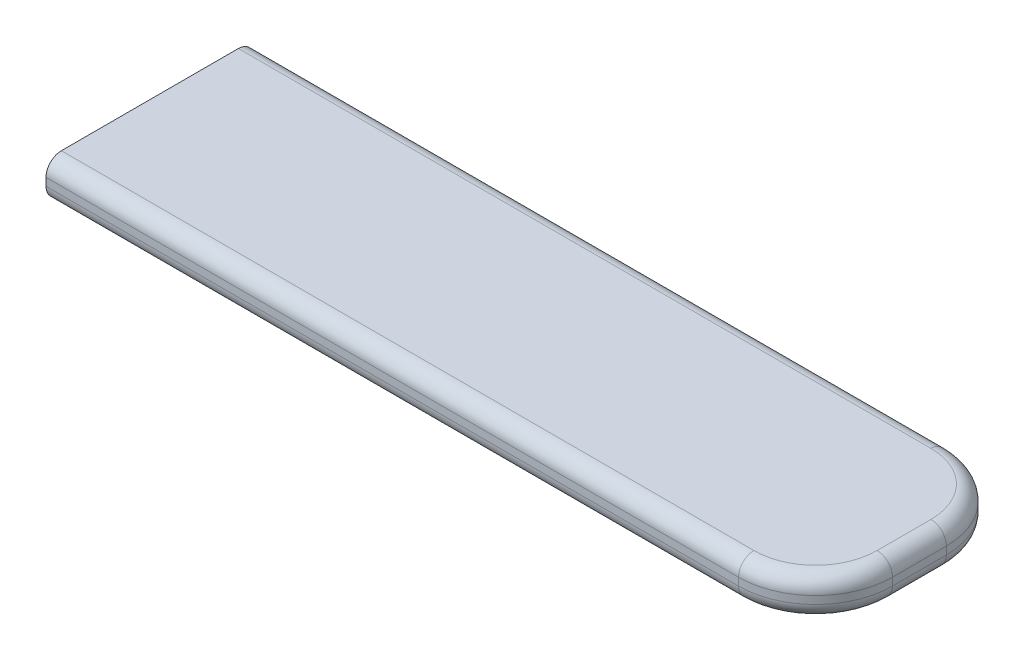
ISO-10303-21;
HEADER;
FILE_DESCRIPTION(('STEP AP214'),'2;1');
FILE_NAME('part.step','',(''),(''),'','','');
FILE_SCHEMA(('AUTOMOTIVE_DESIGN { 1 0 10303 214 1 1 1 1 }'));
ENDSEC;
DATA;
#1=APPLICATION_CONTEXT('core data for automotive mechanical design processes');
#2=APPLICATION_PROTOCOL_DEFINITION('international standard','automotive_design',2000,#1);
#3=PRODUCT_CONTEXT('',#1,'mechanical');
#4=PRODUCT('Part','Part','',(#3));
#5=PRODUCT_RELATED_PRODUCT_CATEGORY('part','',(#4));
#6=PRODUCT_DEFINITION_FORMATION('','',#4);
#7=PRODUCT_DEFINITION_CONTEXT('part definition',#1,'design');
#8=PRODUCT_DEFINITION('design','',#6,#7);
#9=PRODUCT_DEFINITION_SHAPE('','',#8);
#10=(LENGTH_UNIT() NAMED_UNIT(*) SI_UNIT(.MILLI.,.METRE.));
#11=(NAMED_UNIT(*) PLANE_ANGLE_UNIT() SI_UNIT($,.RADIAN.));
#12=(NAMED_UNIT(*) SI_UNIT($,.STERADIAN.) SOLID_ANGLE_UNIT());
#13=UNCERTAINTY_MEASURE_WITH_UNIT(LENGTH_MEASURE(1.E-05),#10,'distance_accuracy_value','');
#14=(GEOMETRIC_REPRESENTATION_CONTEXT(3) GLOBAL_UNCERTAINTY_ASSIGNED_CONTEXT((#13)) GLOBAL_UNIT_ASSIGNED_CONTEXT((#10,
#11,#12)) REPRESENTATION_CONTEXT('',''));
#15=CARTESIAN_POINT('',(0.,0.,0.));
#16=DIRECTION('',(0.,0.,1.));
#17=DIRECTION('',(1.,0.,0.));
#18=AXIS2_PLACEMENT_3D('',#15,#16,#17);
#19=CARTESIAN_POINT('',(0.,50.,0.));
#20=DIRECTION('',(-1.,0.,0.));
#21=DIRECTION('',(0.,0.,1.));
#22=AXIS2_PLACEMENT_3D('',#19,#20,#21);
#23=PLANE('',#22);
#24=DIRECTION('',(0.,-1.,0.));
#25=VECTOR('',#24,1.);
#26=CARTESIAN_POINT('',(0.,0.,-100.));
#27=LINE('',#26,#25);
#28=CARTESIAN_POINT('',(0.,30.,-100.));
#29=VERTEX_POINT('',#28);
#30=CARTESIAN_POINT('',(0.,20.,-100.));
#31=VERTEX_POINT('',#30);
#32=EDGE_CURVE('E156',#29,#31,#27,.T.);
#33=ORIENTED_EDGE('',*,*,#32,.T.);
#34=DIRECTION('',(0.,0.,-1.));
#35=VECTOR('',#34,1.);
#36=CARTESIAN_POINT('',(0.,20.,0.));
#37=LINE('',#36,#35);
#38=CARTESIAN_POINT('',(0.,20.,-170.));
#39=VERTEX_POINT('',#38);
#40=EDGE_CURVE('E272',#31,#39,#37,.T.);
#41=ORIENTED_EDGE('',*,*,#40,.T.);
#42=DIRECTION('',(0.,-1.,0.));
#43=VECTOR('',#42,1.);
#44=CARTESIAN_POINT('',(0.,50.,-170.));
#45=LINE('',#44,#43);
#46=CARTESIAN_POINT('',(0.,30.,-170.));
#47=VERTEX_POINT('',#46);
#48=EDGE_CURVE('E233',#39,#47,#45,.F.);
#49=ORIENTED_EDGE('',*,*,#48,.T.);
#50=DIRECTION('',(0.,0.,-1.));
#51=VECTOR('',#50,1.);
#52=CARTESIAN_POINT('',(0.,30.,-100.));
#53=LINE('',#52,#51);
#54=EDGE_CURVE('E269',#47,#29,#53,.F.);
#55=ORIENTED_EDGE('',*,*,#54,.T.);
#56=EDGE_LOOP('',(#33,#41,#49,#55));
#57=FACE_BOUND('',#56,.T.);
#58=ADVANCED_FACE('F41',(#57),#23,.F.);
#59=CARTESIAN_POINT('',(0.,50.,-270.));
#60=DIRECTION('',(0.,0.,1.));
#61=DIRECTION('',(1.,0.,0.));
#62=AXIS2_PLACEMENT_3D('',#59,#60,#61);
#63=PLANE('',#62);
#64=DIRECTION('',(0.,-1.,0.));
#65=VECTOR('',#64,1.);
#66=CARTESIAN_POINT('',(-100.,50.,-270.));
#67=LINE('',#66,#65);
#68=CARTESIAN_POINT('',(-100.,30.,-270.));
#69=VERTEX_POINT('',#68);
#70=CARTESIAN_POINT('',(-100.,20.,-270.));
#71=VERTEX_POINT('',#70);
#72=EDGE_CURVE('E137',#69,#71,#67,.T.);
#73=ORIENTED_EDGE('',*,*,#72,.T.);
#74=DIRECTION('',(-1.,0.,0.));
#75=VECTOR('',#74,1.);
#76=CARTESIAN_POINT('',(0.,20.,-270.));
#77=LINE('',#76,#75);
#78=CARTESIAN_POINT('',(-1000.,20.,-270.));
#79=VERTEX_POINT('',#78);
#80=EDGE_CURVE('E144',#71,#79,#77,.T.);
#81=ORIENTED_EDGE('',*,*,#80,.T.);
#82=DIRECTION('',(0.,-1.,0.));
#83=VECTOR('',#82,1.);
#84=CARTESIAN_POINT('',(-1000.,50.,-270.));
#85=LINE('',#84,#83);
#86=CARTESIAN_POINT('',(-1000.,30.,-270.));
#87=VERTEX_POINT('',#86);
#88=EDGE_CURVE('E140',#87,#79,#85,.T.);
#89=ORIENTED_EDGE('',*,*,#88,.F.);
#90=DIRECTION('',(-1.,0.,0.));
#91=VECTOR('',#90,1.);
#92=CARTESIAN_POINT('',(-100.,30.,-270.));
#93=LINE('',#92,#91);
#94=EDGE_CURVE('E133',#87,#69,#93,.F.);
#95=ORIENTED_EDGE('',*,*,#94,.T.);
#96=EDGE_LOOP('',(#73,#81,#89,#95));
#97=FACE_BOUND('',#96,.T.);
#98=ADVANCED_FACE('F135',(#97),#63,.F.);
#99=CARTESIAN_POINT('',(-1000.,50.,1.22464679914735E-13));
#100=DIRECTION('',(-1.,0.,0.));
#101=DIRECTION('',(0.,0.,1.));
#102=AXIS2_PLACEMENT_3D('',#99,#100,#101);
#103=PLANE('',#102);
#104=ORIENTED_EDGE('',*,*,#88,.T.);
#105=CARTESIAN_POINT('',(-1000.,20.,-250.));
#106=DIRECTION('',(-1.,0.,0.));
#107=DIRECTION('',(0.,0.,1.));
#108=AXIS2_PLACEMENT_3D('',#105,#106,#107);
#109=CIRCLE('',#108,20.);
#110=CARTESIAN_POINT('',(-1000.,0.,-250.));
#111=VERTEX_POINT('',#110);
#112=EDGE_CURVE('E250',#79,#111,#109,.T.);
#113=ORIENTED_EDGE('',*,*,#112,.T.);
#114=DIRECTION('',(0.,0.,-1.));
#115=VECTOR('',#114,1.);
#116=CARTESIAN_POINT('',(-1000.,0.,1.22464679914735E-13));
#117=LINE('',#116,#115);
#118=CARTESIAN_POINT('',(-1000.,0.,-19.9999999999999));
#119=VERTEX_POINT('',#118);
#120=EDGE_CURVE('E209',#119,#111,#117,.T.);
#121=ORIENTED_EDGE('',*,*,#120,.F.);
#122=CARTESIAN_POINT('',(-1000.,20.,-19.9999999999999));
#123=DIRECTION('',(-1.,0.,0.));
#124=DIRECTION('',(0.,0.,1.));
#125=AXIS2_PLACEMENT_3D('',#122,#123,#124);
#126=CIRCLE('',#125,20.);
#127=CARTESIAN_POINT('',(-1000.,20.,1.22464679914735E-13));
#128=VERTEX_POINT('',#127);
#129=EDGE_CURVE('E244',#119,#128,#126,.T.);
#130=ORIENTED_EDGE('',*,*,#129,.T.);
#131=DIRECTION('',(0.,-1.,0.));
#132=VECTOR('',#131,1.);
#133=CARTESIAN_POINT('',(-1000.,50.,1.22464679914735E-13));
#134=LINE('',#133,#132);
#135=CARTESIAN_POINT('',(-1000.,30.,1.22464679914735E-13));
#136=VERTEX_POINT('',#135);
#137=EDGE_CURVE('E222',#136,#128,#134,.T.);
#138=ORIENTED_EDGE('',*,*,#137,.F.);
#139=CARTESIAN_POINT('',(-1000.,30.,-19.9999999999999));
#140=DIRECTION('',(-1.,0.,0.));
#141=DIRECTION('',(0.,0.,1.));
#142=AXIS2_PLACEMENT_3D('',#139,#140,#141);
#143=CIRCLE('',#142,20.);
#144=CARTESIAN_POINT('',(-1000.,50.,-19.9999999999999));
#145=VERTEX_POINT('',#144);
#146=EDGE_CURVE('E241',#136,#145,#143,.T.);
#147=ORIENTED_EDGE('',*,*,#146,.T.);
#148=DIRECTION('',(0.,0.,-1.));
#149=VECTOR('',#148,1.);
#150=CARTESIAN_POINT('',(-1000.,50.,1.22464679914735E-13));
#151=LINE('',#150,#149);
#152=CARTESIAN_POINT('',(-1000.,50.,-250.));
#153=VERTEX_POINT('',#152);
#154=EDGE_CURVE('E216',#145,#153,#151,.T.);
#155=ORIENTED_EDGE('',*,*,#154,.T.);
#156=CARTESIAN_POINT('',(-1000.,30.,-250.));
#157=DIRECTION('',(-1.,0.,0.));
#158=DIRECTION('',(0.,0.,1.));
#159=AXIS2_PLACEMENT_3D('',#156,#157,#158);
#160=CIRCLE('',#159,20.);
#161=EDGE_CURVE('E247',#153,#87,#160,.T.);
#162=ORIENTED_EDGE('',*,*,#161,.T.);
#163=EDGE_LOOP('',(#104,#113,#121,#130,#138,#147,#155,#162));
#164=FACE_BOUND('',#163,.T.);
#165=ADVANCED_FACE('F302',(#164),#103,.T.);
#166=CARTESIAN_POINT('',(0.,50.,0.));
#167=DIRECTION('',(0.,0.,1.));
#168=DIRECTION('',(1.,0.,0.));
#169=AXIS2_PLACEMENT_3D('',#166,#167,#168);
#170=PLANE('',#169);
#171=ORIENTED_EDGE('',*,*,#137,.T.);
#172=DIRECTION('',(-1.,0.,0.));
#173=VECTOR('',#172,1.);
#174=CARTESIAN_POINT('',(-100.,20.,0.));
#175=LINE('',#174,#173);
#176=CARTESIAN_POINT('',(-100.,20.,0.));
#177=VERTEX_POINT('',#176);
#178=EDGE_CURVE('E11',#128,#177,#175,.F.);
#179=ORIENTED_EDGE('',*,*,#178,.T.);
#180=DIRECTION('',(0.,-1.,0.));
#181=VECTOR('',#180,1.);
#182=CARTESIAN_POINT('',(-100.,50.,0.));
#183=LINE('',#182,#181);
#184=CARTESIAN_POINT('',(-100.,30.,0.));
#185=VERTEX_POINT('',#184);
#186=EDGE_CURVE('E145',#177,#185,#183,.F.);
#187=ORIENTED_EDGE('',*,*,#186,.T.);
#188=DIRECTION('',(-1.,0.,0.));
#189=VECTOR('',#188,1.);
#190=CARTESIAN_POINT('',(0.,30.,0.));
#191=LINE('',#190,#189);
#192=EDGE_CURVE('E51',#185,#136,#191,.T.);
#193=ORIENTED_EDGE('',*,*,#192,.T.);
#194=EDGE_LOOP('',(#171,#179,#187,#193));
#195=FACE_BOUND('',#194,.T.);
#196=ADVANCED_FACE('F296',(#195),#170,.T.);
#197=CARTESIAN_POINT('',(0.,50.,0.));
#198=DIRECTION('',(0.,1.,0.));
#199=DIRECTION('',(0.,0.,1.));
#200=AXIS2_PLACEMENT_3D('',#197,#198,#199);
#201=PLANE('',#200);
#202=CARTESIAN_POINT('',(-100.,50.,-170.));
#203=DIRECTION('',(0.,1.,0.));
#204=DIRECTION('',(0.,0.,1.));
#205=AXIS2_PLACEMENT_3D('',#202,#203,#204);
#206=CIRCLE('',#205,80.);
#207=CARTESIAN_POINT('',(-20.,50.,-170.));
#208=VERTEX_POINT('',#207);
#209=CARTESIAN_POINT('',(-100.,50.,-250.));
#210=VERTEX_POINT('',#209);
#211=EDGE_CURVE('E59',#208,#210,#206,.T.);
#212=ORIENTED_EDGE('',*,*,#211,.T.);
#213=DIRECTION('',(-1.,0.,0.));
#214=VECTOR('',#213,1.);
#215=CARTESIAN_POINT('',(-1000.,50.,-250.));
#216=LINE('',#215,#214);
#217=EDGE_CURVE('E168',#210,#153,#216,.T.);
#218=ORIENTED_EDGE('',*,*,#217,.T.);
#219=ORIENTED_EDGE('',*,*,#154,.F.);
#220=DIRECTION('',(-1.,0.,0.));
#221=VECTOR('',#220,1.);
#222=CARTESIAN_POINT('',(0.,50.,-20.));
#223=LINE('',#222,#221);
#224=CARTESIAN_POINT('',(-100.,50.,-20.));
#225=VERTEX_POINT('',#224);
#226=EDGE_CURVE('E281',#145,#225,#223,.F.);
#227=ORIENTED_EDGE('',*,*,#226,.T.);
#228=CARTESIAN_POINT('',(-100.,50.,-100.));
#229=DIRECTION('',(0.,1.,0.));
#230=DIRECTION('',(0.,0.,1.));
#231=AXIS2_PLACEMENT_3D('',#228,#229,#230);
#232=CIRCLE('',#231,80.);
#233=CARTESIAN_POINT('',(-20.,50.,-100.));
#234=VERTEX_POINT('',#233);
#235=EDGE_CURVE('E284',#225,#234,#232,.T.);
#236=ORIENTED_EDGE('',*,*,#235,.T.);
#237=DIRECTION('',(0.,0.,-1.));
#238=VECTOR('',#237,1.);
#239=CARTESIAN_POINT('',(-20.,50.,-170.));
#240=LINE('',#239,#238);
#241=EDGE_CURVE('E64',#234,#208,#240,.T.);
#242=ORIENTED_EDGE('',*,*,#241,.T.);
#243=EDGE_LOOP('',(#212,#218,#219,#227,#236,#242));
#244=FACE_BOUND('',#243,.T.);
#245=ADVANCED_FACE('F306',(#244),#201,.T.);
#246=CARTESIAN_POINT('',(0.,0.,0.));
#247=DIRECTION('',(0.,1.,0.));
#248=DIRECTION('',(0.,0.,1.));
#249=AXIS2_PLACEMENT_3D('',#246,#247,#248);
#250=PLANE('',#249);
#251=ORIENTED_EDGE('',*,*,#120,.T.);
#252=DIRECTION('',(-1.,0.,0.));
#253=VECTOR('',#252,1.);
#254=CARTESIAN_POINT('',(0.,0.,-250.));
#255=LINE('',#254,#253);
#256=CARTESIAN_POINT('',(-100.,0.,-250.));
#257=VERTEX_POINT('',#256);
#258=EDGE_CURVE('E165',#111,#257,#255,.F.);
#259=ORIENTED_EDGE('',*,*,#258,.T.);
#260=CARTESIAN_POINT('',(-100.,0.,-170.));
#261=DIRECTION('',(0.,1.,0.));
#262=DIRECTION('',(0.,0.,1.));
#263=AXIS2_PLACEMENT_3D('',#260,#261,#262);
#264=CIRCLE('',#263,80.);
#265=CARTESIAN_POINT('',(-20.,0.,-170.));
#266=VERTEX_POINT('',#265);
#267=EDGE_CURVE('E262',#257,#266,#264,.F.);
#268=ORIENTED_EDGE('',*,*,#267,.T.);
#269=DIRECTION('',(0.,0.,-1.));
#270=VECTOR('',#269,1.);
#271=CARTESIAN_POINT('',(-20.,0.,0.));
#272=LINE('',#271,#270);
#273=CARTESIAN_POINT('',(-20.,0.,-100.));
#274=VERTEX_POINT('',#273);
#275=EDGE_CURVE('E259',#266,#274,#272,.F.);
#276=ORIENTED_EDGE('',*,*,#275,.T.);
#277=CARTESIAN_POINT('',(-100.,0.,-100.));
#278=DIRECTION('',(0.,1.,0.));
#279=DIRECTION('',(0.,0.,1.));
#280=AXIS2_PLACEMENT_3D('',#277,#278,#279);
#281=CIRCLE('',#280,80.);
#282=CARTESIAN_POINT('',(-100.,0.,-20.));
#283=VERTEX_POINT('',#282);
#284=EDGE_CURVE('E256',#274,#283,#281,.F.);
#285=ORIENTED_EDGE('',*,*,#284,.T.);
#286=DIRECTION('',(-1.,0.,0.));
#287=VECTOR('',#286,1.);
#288=CARTESIAN_POINT('',(-1000.,0.,-19.9999999999999));
#289=LINE('',#288,#287);
#290=EDGE_CURVE('E253',#283,#119,#289,.T.);
#291=ORIENTED_EDGE('',*,*,#290,.T.);
#292=EDGE_LOOP('',(#251,#259,#268,#276,#285,#291));
#293=FACE_BOUND('',#292,.T.);
#294=ADVANCED_FACE('F309',(#293),#250,.F.);
#295=CARTESIAN_POINT('',(-100.,50.,-170.));
#296=DIRECTION('',(0.,-1.,0.));
#297=DIRECTION('',(0.,0.,-1.));
#298=AXIS2_PLACEMENT_3D('',#295,#296,#297);
#299=CYLINDRICAL_SURFACE('',#298,100.);
#300=ORIENTED_EDGE('',*,*,#48,.F.);
#301=CARTESIAN_POINT('',(-100.,20.,-170.));
#302=DIRECTION('',(0.,1.,0.));
#303=DIRECTION('',(0.,0.,1.));
#304=AXIS2_PLACEMENT_3D('',#301,#302,#303);
#305=CIRCLE('',#304,100.);
#306=EDGE_CURVE('E154',#39,#71,#305,.T.);
#307=ORIENTED_EDGE('',*,*,#306,.T.);
#308=ORIENTED_EDGE('',*,*,#72,.F.);
#309=CARTESIAN_POINT('',(-100.,30.,-170.));
#310=DIRECTION('',(0.,1.,0.));
#311=DIRECTION('',(0.,0.,1.));
#312=AXIS2_PLACEMENT_3D('',#309,#310,#311);
#313=CIRCLE('',#312,100.);
#314=EDGE_CURVE('E151',#69,#47,#313,.F.);
#315=ORIENTED_EDGE('',*,*,#314,.T.);
#316=EDGE_LOOP('',(#300,#307,#308,#315));
#317=FACE_BOUND('',#316,.T.);
#318=ADVANCED_FACE('F150',(#317),#299,.T.);
#319=CARTESIAN_POINT('',(-100.,50.,-100.));
#320=DIRECTION('',(0.,1.,0.));
#321=DIRECTION('',(0.,0.,1.));
#322=AXIS2_PLACEMENT_3D('',#319,#320,#321);
#323=CYLINDRICAL_SURFACE('',#322,100.);
#324=ORIENTED_EDGE('',*,*,#186,.F.);
#325=CARTESIAN_POINT('',(-100.,20.,-100.));
#326=DIRECTION('',(0.,1.,0.));
#327=DIRECTION('',(0.,0.,1.));
#328=AXIS2_PLACEMENT_3D('',#325,#326,#327);
#329=CIRCLE('',#328,100.);
#330=EDGE_CURVE('E278',#177,#31,#329,.T.);
#331=ORIENTED_EDGE('',*,*,#330,.T.);
#332=ORIENTED_EDGE('',*,*,#32,.F.);
#333=CARTESIAN_POINT('',(-100.,30.,-100.));
#334=DIRECTION('',(0.,1.,0.));
#335=DIRECTION('',(0.,0.,1.));
#336=AXIS2_PLACEMENT_3D('',#333,#334,#335);
#337=CIRCLE('',#336,100.);
#338=EDGE_CURVE('E275',#29,#185,#337,.F.);
#339=ORIENTED_EDGE('',*,*,#338,.T.);
#340=EDGE_LOOP('',(#324,#331,#332,#339));
#341=FACE_BOUND('',#340,.T.);
#342=ADVANCED_FACE('F318',(#341),#323,.T.);
#343=CARTESIAN_POINT('',(0.,20.,-20.));
#344=DIRECTION('',(1.,0.,0.));
#345=DIRECTION('',(0.,0.,-1.));
#346=AXIS2_PLACEMENT_3D('',#343,#344,#345);
#347=CYLINDRICAL_SURFACE('',#346,20.);
#348=ORIENTED_EDGE('',*,*,#129,.F.);
#349=ORIENTED_EDGE('',*,*,#290,.F.);
#350=CARTESIAN_POINT('',(-100.,20.,-20.));
#351=DIRECTION('',(1.,0.,0.));
#352=DIRECTION('',(0.,0.,-1.));
#353=AXIS2_PLACEMENT_3D('',#350,#351,#352);
#354=CIRCLE('',#353,20.);
#355=EDGE_CURVE('E175',#177,#283,#354,.T.);
#356=ORIENTED_EDGE('',*,*,#355,.F.);
#357=ORIENTED_EDGE('',*,*,#178,.F.);
#358=EDGE_LOOP('',(#348,#349,#356,#357));
#359=FACE_BOUND('',#358,.T.);
#360=ADVANCED_FACE('F341',(#359),#347,.T.);
#361=CARTESIAN_POINT('',(-100.,20.,-100.));
#362=DIRECTION('',(0.,1.,0.));
#363=DIRECTION('',(0.,0.,1.));
#364=AXIS2_PLACEMENT_3D('',#361,#362,#363);
#365=TOROIDAL_SURFACE('',#364,80.,20.);
#366=ORIENTED_EDGE('',*,*,#355,.T.);
#367=ORIENTED_EDGE('',*,*,#284,.F.);
#368=CARTESIAN_POINT('',(-20.,20.,-100.));
#369=DIRECTION('',(0.,0.,-1.));
#370=DIRECTION('',(-1.,0.,0.));
#371=AXIS2_PLACEMENT_3D('',#368,#369,#370);
#372=CIRCLE('',#371,20.);
#373=EDGE_CURVE('E198',#31,#274,#372,.T.);
#374=ORIENTED_EDGE('',*,*,#373,.F.);
#375=ORIENTED_EDGE('',*,*,#330,.F.);
#376=EDGE_LOOP('',(#366,#367,#374,#375));
#377=FACE_BOUND('',#376,.T.);
#378=ADVANCED_FACE('F315',(#377),#365,.T.);
#379=CARTESIAN_POINT('',(-20.,20.,0.));
#380=DIRECTION('',(0.,0.,-1.));
#381=DIRECTION('',(-1.,0.,0.));
#382=AXIS2_PLACEMENT_3D('',#379,#380,#381);
#383=CYLINDRICAL_SURFACE('',#382,20.);
#384=ORIENTED_EDGE('',*,*,#373,.T.);
#385=ORIENTED_EDGE('',*,*,#275,.F.);
#386=CARTESIAN_POINT('',(-20.,20.,-170.));
#387=DIRECTION('',(0.,0.,-1.));
#388=DIRECTION('',(-1.,0.,0.));
#389=AXIS2_PLACEMENT_3D('',#386,#387,#388);
#390=CIRCLE('',#389,20.);
#391=EDGE_CURVE('E191',#39,#266,#390,.T.);
#392=ORIENTED_EDGE('',*,*,#391,.F.);
#393=ORIENTED_EDGE('',*,*,#40,.F.);
#394=EDGE_LOOP('',(#384,#385,#392,#393));
#395=FACE_BOUND('',#394,.T.);
#396=ADVANCED_FACE('F313',(#395),#383,.T.);
#397=CARTESIAN_POINT('',(-100.,20.,-170.));
#398=DIRECTION('',(0.,1.,0.));
#399=DIRECTION('',(0.,0.,1.));
#400=AXIS2_PLACEMENT_3D('',#397,#398,#399);
#401=TOROIDAL_SURFACE('',#400,80.,20.);
#402=ORIENTED_EDGE('',*,*,#391,.T.);
#403=ORIENTED_EDGE('',*,*,#267,.F.);
#404=CARTESIAN_POINT('',(-100.,20.,-250.));
#405=DIRECTION('',(-1.,0.,0.));
#406=DIRECTION('',(0.,0.,1.));
#407=AXIS2_PLACEMENT_3D('',#404,#405,#406);
#408=CIRCLE('',#407,20.);
#409=EDGE_CURVE('E184',#71,#257,#408,.T.);
#410=ORIENTED_EDGE('',*,*,#409,.F.);
#411=ORIENTED_EDGE('',*,*,#306,.F.);
#412=EDGE_LOOP('',(#402,#403,#410,#411));
#413=FACE_BOUND('',#412,.T.);
#414=ADVANCED_FACE('F311',(#413),#401,.T.);
#415=CARTESIAN_POINT('',(0.,20.,-250.));
#416=DIRECTION('',(-1.,0.,0.));
#417=DIRECTION('',(0.,0.,1.));
#418=AXIS2_PLACEMENT_3D('',#415,#416,#417);
#419=CYLINDRICAL_SURFACE('',#418,20.);
#420=ORIENTED_EDGE('',*,*,#409,.T.);
#421=ORIENTED_EDGE('',*,*,#258,.F.);
#422=ORIENTED_EDGE('',*,*,#112,.F.);
#423=ORIENTED_EDGE('',*,*,#80,.F.);
#424=EDGE_LOOP('',(#420,#421,#422,#423));
#425=FACE_BOUND('',#424,.T.);
#426=ADVANCED_FACE('F307',(#425),#419,.T.);
#427=CARTESIAN_POINT('',(0.,30.,-20.));
#428=DIRECTION('',(-1.,0.,0.));
#429=DIRECTION('',(0.,0.,1.));
#430=AXIS2_PLACEMENT_3D('',#427,#428,#429);
#431=CYLINDRICAL_SURFACE('',#430,20.);
#432=ORIENTED_EDGE('',*,*,#146,.F.);
#433=ORIENTED_EDGE('',*,*,#192,.F.);
#434=CARTESIAN_POINT('',(-100.,30.,-20.));
#435=DIRECTION('',(1.,0.,0.));
#436=DIRECTION('',(0.,0.,-1.));
#437=AXIS2_PLACEMENT_3D('',#434,#435,#436);
#438=CIRCLE('',#437,20.);
#439=EDGE_CURVE('E45',#225,#185,#438,.T.);
#440=ORIENTED_EDGE('',*,*,#439,.F.);
#441=ORIENTED_EDGE('',*,*,#226,.F.);
#442=EDGE_LOOP('',(#432,#433,#440,#441));
#443=FACE_BOUND('',#442,.T.);
#444=ADVANCED_FACE('F43',(#443),#431,.T.);
#445=CARTESIAN_POINT('',(-100.,30.,-100.));
#446=DIRECTION('',(0.,1.,0.));
#447=DIRECTION('',(0.,0.,1.));
#448=AXIS2_PLACEMENT_3D('',#445,#446,#447);
#449=TOROIDAL_SURFACE('',#448,80.,20.);
#450=ORIENTED_EDGE('',*,*,#439,.T.);
#451=ORIENTED_EDGE('',*,*,#338,.F.);
#452=CARTESIAN_POINT('',(-20.,30.,-100.));
#453=DIRECTION('',(0.,0.,-1.));
#454=DIRECTION('',(-1.,0.,0.));
#455=AXIS2_PLACEMENT_3D('',#452,#453,#454);
#456=CIRCLE('',#455,20.);
#457=EDGE_CURVE('E172',#234,#29,#456,.T.);
#458=ORIENTED_EDGE('',*,*,#457,.F.);
#459=ORIENTED_EDGE('',*,*,#235,.F.);
#460=EDGE_LOOP('',(#450,#451,#458,#459));
#461=FACE_BOUND('',#460,.T.);
#462=ADVANCED_FACE('F322',(#461),#449,.T.);
#463=CARTESIAN_POINT('',(-20.,30.,0.));
#464=DIRECTION('',(0.,0.,1.));
#465=DIRECTION('',(1.,0.,0.));
#466=AXIS2_PLACEMENT_3D('',#463,#464,#465);
#467=CYLINDRICAL_SURFACE('',#466,20.);
#468=ORIENTED_EDGE('',*,*,#457,.T.);
#469=ORIENTED_EDGE('',*,*,#54,.F.);
#470=CARTESIAN_POINT('',(-20.,30.,-170.));
#471=DIRECTION('',(0.,0.,-1.));
#472=DIRECTION('',(-1.,0.,0.));
#473=AXIS2_PLACEMENT_3D('',#470,#471,#472);
#474=CIRCLE('',#473,20.);
#475=EDGE_CURVE('E163',#208,#47,#474,.T.);
#476=ORIENTED_EDGE('',*,*,#475,.F.);
#477=ORIENTED_EDGE('',*,*,#241,.F.);
#478=EDGE_LOOP('',(#468,#469,#476,#477));
#479=FACE_BOUND('',#478,.T.);
#480=ADVANCED_FACE('F320',(#479),#467,.T.);
#481=CARTESIAN_POINT('',(-100.,30.,-170.));
#482=DIRECTION('',(0.,1.,0.));
#483=DIRECTION('',(0.,0.,1.));
#484=AXIS2_PLACEMENT_3D('',#481,#482,#483);
#485=TOROIDAL_SURFACE('',#484,80.,20.);
#486=ORIENTED_EDGE('',*,*,#475,.T.);
#487=ORIENTED_EDGE('',*,*,#314,.F.);
#488=CARTESIAN_POINT('',(-100.,30.,-250.));
#489=DIRECTION('',(-1.,0.,0.));
#490=DIRECTION('',(0.,0.,1.));
#491=AXIS2_PLACEMENT_3D('',#488,#489,#490);
#492=CIRCLE('',#491,20.);
#493=EDGE_CURVE('E161',#210,#69,#492,.T.);
#494=ORIENTED_EDGE('',*,*,#493,.F.);
#495=ORIENTED_EDGE('',*,*,#211,.F.);
#496=EDGE_LOOP('',(#486,#487,#494,#495));
#497=FACE_BOUND('',#496,.T.);
#498=ADVANCED_FACE('F160',(#497),#485,.T.);
#499=CARTESIAN_POINT('',(0.,30.,-250.));
#500=DIRECTION('',(1.,0.,0.));
#501=DIRECTION('',(0.,0.,-1.));
#502=AXIS2_PLACEMENT_3D('',#499,#500,#501);
#503=CYLINDRICAL_SURFACE('',#502,20.);
#504=ORIENTED_EDGE('',*,*,#493,.T.);
#505=ORIENTED_EDGE('',*,*,#94,.F.);
#506=ORIENTED_EDGE('',*,*,#161,.F.);
#507=ORIENTED_EDGE('',*,*,#217,.F.);
#508=EDGE_LOOP('',(#504,#505,#506,#507));
#509=FACE_BOUND('',#508,.T.);
#510=ADVANCED_FACE('F167',(#509),#503,.T.);
#511=CLOSED_SHELL('',(#58,#98,#165,#196,#245,#294,#318,#342,#360,#378,#396,#414,#426,#444,#462,
#480,#498,#510));
#512=MANIFOLD_SOLID_BREP('B2',#511);
#513=ADVANCED_BREP_SHAPE_REPRESENTATION('',(#18,#512),#14);
#514=SHAPE_DEFINITION_REPRESENTATION(#9,#513);
ENDSEC;
END-ISO-10303-21;
